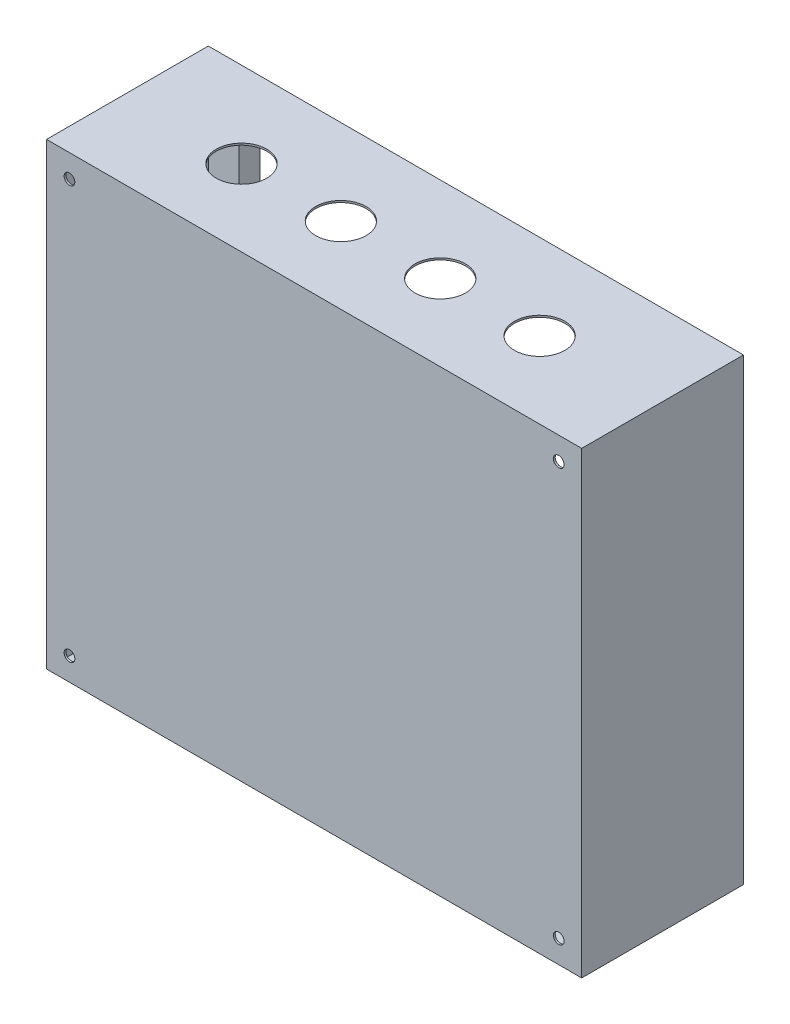
ISO-10303-21;
HEADER;
FILE_DESCRIPTION(('STEP AP214'),'2;1');
FILE_NAME('part.step','',(''),(''),'','','');
FILE_SCHEMA(('AUTOMOTIVE_DESIGN { 1 0 10303 214 1 1 1 1 }'));
ENDSEC;
DATA;
#1=APPLICATION_CONTEXT('core data for automotive mechanical design processes');
#2=APPLICATION_PROTOCOL_DEFINITION('international standard','automotive_design',2000,#1);
#3=PRODUCT_CONTEXT('',#1,'mechanical');
#4=PRODUCT('Part','Part','',(#3));
#5=PRODUCT_RELATED_PRODUCT_CATEGORY('part','',(#4));
#6=PRODUCT_DEFINITION_FORMATION('','',#4);
#7=PRODUCT_DEFINITION_CONTEXT('part definition',#1,'design');
#8=PRODUCT_DEFINITION('design','',#6,#7);
#9=PRODUCT_DEFINITION_SHAPE('','',#8);
#10=(LENGTH_UNIT() NAMED_UNIT(*) SI_UNIT(.MILLI.,.METRE.));
#11=(NAMED_UNIT(*) PLANE_ANGLE_UNIT() SI_UNIT($,.RADIAN.));
#12=(NAMED_UNIT(*) SI_UNIT($,.STERADIAN.) SOLID_ANGLE_UNIT());
#13=UNCERTAINTY_MEASURE_WITH_UNIT(LENGTH_MEASURE(1.E-05),#10,'distance_accuracy_value','');
#14=(GEOMETRIC_REPRESENTATION_CONTEXT(3) GLOBAL_UNCERTAINTY_ASSIGNED_CONTEXT((#13)) GLOBAL_UNIT_ASSIGNED_CONTEXT((#10,
#11,#12)) REPRESENTATION_CONTEXT('',''));
#15=CARTESIAN_POINT('',(0.,0.,0.));
#16=DIRECTION('',(0.,0.,1.));
#17=DIRECTION('',(1.,0.,0.));
#18=AXIS2_PLACEMENT_3D('',#15,#16,#17);
#19=CARTESIAN_POINT('',(0.,0.,-52.9));
#20=DIRECTION('',(0.,0.,1.));
#21=DIRECTION('',(1.,0.,0.));
#22=AXIS2_PLACEMENT_3D('',#19,#20,#21);
#23=PLANE('',#22);
#24=DIRECTION('',(1.,0.,0.));
#25=VECTOR('',#24,1.);
#26=CARTESIAN_POINT('',(-175.,-150.,-52.9));
#27=LINE('',#26,#25);
#28=CARTESIAN_POINT('',(-175.,-150.,-52.9));
#29=VERTEX_POINT('',#28);
#30=CARTESIAN_POINT('',(175.,-150.,-52.9));
#31=VERTEX_POINT('',#30);
#32=EDGE_CURVE('E328',#29,#31,#27,.T.);
#33=ORIENTED_EDGE('',*,*,#32,.F.);
#34=DIRECTION('',(0.,-1.,0.));
#35=VECTOR('',#34,1.);
#36=CARTESIAN_POINT('',(-175.,-150.,-52.9));
#37=LINE('',#36,#35);
#38=CARTESIAN_POINT('',(-175.,150.,-52.9));
#39=VERTEX_POINT('',#38);
#40=EDGE_CURVE('E333',#39,#29,#37,.T.);
#41=ORIENTED_EDGE('',*,*,#40,.F.);
#42=DIRECTION('',(-1.,0.,0.));
#43=VECTOR('',#42,1.);
#44=CARTESIAN_POINT('',(-175.,150.,-52.9));
#45=LINE('',#44,#43);
#46=CARTESIAN_POINT('',(175.,150.,-52.9));
#47=VERTEX_POINT('',#46);
#48=EDGE_CURVE('E344',#47,#39,#45,.T.);
#49=ORIENTED_EDGE('',*,*,#48,.F.);
#50=DIRECTION('',(0.,1.,0.));
#51=VECTOR('',#50,1.);
#52=CARTESIAN_POINT('',(175.,-150.,-52.9));
#53=LINE('',#52,#51);
#54=EDGE_CURVE('E342',#31,#47,#53,.T.);
#55=ORIENTED_EDGE('',*,*,#54,.F.);
#56=EDGE_LOOP('',(#33,#41,#49,#55));
#57=FACE_BOUND('',#56,.T.);
#58=DIRECTION('',(0.,-1.,0.));
#59=VECTOR('',#58,1.);
#60=CARTESIAN_POINT('',(155.,130.,-52.9));
#61=LINE('',#60,#59);
#62=CARTESIAN_POINT('',(155.,130.,-52.9));
#63=VERTEX_POINT('',#62);
#64=CARTESIAN_POINT('',(155.,-130.,-52.9));
#65=VERTEX_POINT('',#64);
#66=EDGE_CURVE('E278',#63,#65,#61,.T.);
#67=ORIENTED_EDGE('',*,*,#66,.F.);
#68=DIRECTION('',(1.,0.,0.));
#69=VECTOR('',#68,1.);
#70=CARTESIAN_POINT('',(-155.,130.,-52.9));
#71=LINE('',#70,#69);
#72=CARTESIAN_POINT('',(-155.,130.,-52.9));
#73=VERTEX_POINT('',#72);
#74=EDGE_CURVE('E300',#73,#63,#71,.T.);
#75=ORIENTED_EDGE('',*,*,#74,.F.);
#76=DIRECTION('',(0.,1.,0.));
#77=VECTOR('',#76,1.);
#78=CARTESIAN_POINT('',(-155.,-130.,-52.9));
#79=LINE('',#78,#77);
#80=CARTESIAN_POINT('',(-155.,-130.,-52.9));
#81=VERTEX_POINT('',#80);
#82=EDGE_CURVE('E313',#81,#73,#79,.T.);
#83=ORIENTED_EDGE('',*,*,#82,.F.);
#84=DIRECTION('',(-1.,0.,0.));
#85=VECTOR('',#84,1.);
#86=CARTESIAN_POINT('',(155.,-130.,-52.9));
#87=LINE('',#86,#85);
#88=EDGE_CURVE('E60',#65,#81,#87,.T.);
#89=ORIENTED_EDGE('',*,*,#88,.F.);
#90=EDGE_LOOP('',(#67,#75,#83,#89));
#91=FACE_BOUND('',#90,.T.);
#92=ADVANCED_FACE('F37',(#57,#91),#23,.F.);
#93=CARTESIAN_POINT('',(-175.,-150.,52.9));
#94=DIRECTION('',(0.,1.,0.));
#95=DIRECTION('',(0.,0.,1.));
#96=AXIS2_PLACEMENT_3D('',#93,#94,#95);
#97=PLANE('',#96);
#98=ORIENTED_EDGE('',*,*,#32,.T.);
#99=DIRECTION('',(0.,0.,-1.));
#100=VECTOR('',#99,1.);
#101=CARTESIAN_POINT('',(175.,-150.,52.9));
#102=LINE('',#101,#100);
#103=CARTESIAN_POINT('',(175.,-150.,52.9));
#104=VERTEX_POINT('',#103);
#105=EDGE_CURVE('E11',#104,#31,#102,.T.);
#106=ORIENTED_EDGE('',*,*,#105,.F.);
#107=DIRECTION('',(1.,0.,0.));
#108=VECTOR('',#107,1.);
#109=CARTESIAN_POINT('',(-175.,-150.,52.9));
#110=LINE('',#109,#108);
#111=CARTESIAN_POINT('',(-175.,-150.,52.9));
#112=VERTEX_POINT('',#111);
#113=EDGE_CURVE('E329',#112,#104,#110,.T.);
#114=ORIENTED_EDGE('',*,*,#113,.F.);
#115=DIRECTION('',(0.,0.,-1.));
#116=VECTOR('',#115,1.);
#117=CARTESIAN_POINT('',(-175.,-150.,52.9));
#118=LINE('',#117,#116);
#119=EDGE_CURVE('E339',#112,#29,#118,.T.);
#120=ORIENTED_EDGE('',*,*,#119,.T.);
#121=EDGE_LOOP('',(#98,#106,#114,#120));
#122=FACE_BOUND('',#121,.T.);
#123=ADVANCED_FACE('F39',(#122),#97,.F.);
#124=CARTESIAN_POINT('',(175.,-150.,52.9));
#125=DIRECTION('',(-1.,0.,0.));
#126=DIRECTION('',(0.,0.,1.));
#127=AXIS2_PLACEMENT_3D('',#124,#125,#126);
#128=PLANE('',#127);
#129=ORIENTED_EDGE('',*,*,#54,.T.);
#130=DIRECTION('',(0.,0.,-1.));
#131=VECTOR('',#130,1.);
#132=CARTESIAN_POINT('',(175.,150.,52.9));
#133=LINE('',#132,#131);
#134=CARTESIAN_POINT('',(175.,150.,52.9));
#135=VERTEX_POINT('',#134);
#136=EDGE_CURVE('E45',#135,#47,#133,.T.);
#137=ORIENTED_EDGE('',*,*,#136,.F.);
#138=DIRECTION('',(0.,1.,0.));
#139=VECTOR('',#138,1.);
#140=CARTESIAN_POINT('',(175.,-150.,52.9));
#141=LINE('',#140,#139);
#142=EDGE_CURVE('E332',#104,#135,#141,.T.);
#143=ORIENTED_EDGE('',*,*,#142,.F.);
#144=ORIENTED_EDGE('',*,*,#105,.T.);
#145=EDGE_LOOP('',(#129,#137,#143,#144));
#146=FACE_BOUND('',#145,.T.);
#147=ADVANCED_FACE('F371',(#146),#128,.F.);
#148=CARTESIAN_POINT('',(-175.,150.,52.9));
#149=DIRECTION('',(0.,-1.,0.));
#150=DIRECTION('',(1.,0.,0.));
#151=AXIS2_PLACEMENT_3D('',#148,#149,#150);
#152=PLANE('',#151);
#153=CARTESIAN_POINT('',(-97.4999999999999,150.,2.90000000000045));
#154=DIRECTION('',(0.,1.,0.));
#155=DIRECTION('',(-1.,0.,0.));
#156=AXIS2_PLACEMENT_3D('',#153,#154,#155);
#157=CIRCLE('',#156,16.5);
#158=CARTESIAN_POINT('',(-114.,150.,2.90000000000045));
#159=VERTEX_POINT('',#158);
#160=EDGE_CURVE('E445',#159,#159,#157,.T.);
#161=ORIENTED_EDGE('',*,*,#160,.F.);
#162=EDGE_LOOP('',(#161));
#163=FACE_BOUND('',#162,.T.);
#164=CARTESIAN_POINT('',(97.5000000000001,150.,2.89999999999999));
#165=DIRECTION('',(0.,1.,0.));
#166=DIRECTION('',(-1.,0.,0.));
#167=AXIS2_PLACEMENT_3D('',#164,#165,#166);
#168=CIRCLE('',#167,16.5);
#169=CARTESIAN_POINT('',(81.0000000000001,150.,2.89999999999999));
#170=VERTEX_POINT('',#169);
#171=EDGE_CURVE('E439',#170,#170,#168,.T.);
#172=ORIENTED_EDGE('',*,*,#171,.F.);
#173=EDGE_LOOP('',(#172));
#174=FACE_BOUND('',#173,.T.);
#175=CARTESIAN_POINT('',(32.5000000000001,150.,2.89999999999999));
#176=DIRECTION('',(0.,1.,0.));
#177=DIRECTION('',(-1.,0.,0.));
#178=AXIS2_PLACEMENT_3D('',#175,#176,#177);
#179=CIRCLE('',#178,16.5);
#180=CARTESIAN_POINT('',(16.0000000000001,150.,2.89999999999999));
#181=VERTEX_POINT('',#180);
#182=EDGE_CURVE('E433',#181,#181,#179,.T.);
#183=ORIENTED_EDGE('',*,*,#182,.F.);
#184=EDGE_LOOP('',(#183));
#185=FACE_BOUND('',#184,.T.);
#186=CARTESIAN_POINT('',(-32.4999999999999,150.,2.89999999999999));
#187=DIRECTION('',(0.,1.,0.));
#188=DIRECTION('',(-1.,0.,0.));
#189=AXIS2_PLACEMENT_3D('',#186,#187,#188);
#190=CIRCLE('',#189,16.5);
#191=CARTESIAN_POINT('',(-48.9999999999999,150.,2.89999999999999));
#192=VERTEX_POINT('',#191);
#193=EDGE_CURVE('E424',#192,#192,#190,.T.);
#194=ORIENTED_EDGE('',*,*,#193,.F.);
#195=EDGE_LOOP('',(#194));
#196=FACE_BOUND('',#195,.T.);
#197=ORIENTED_EDGE('',*,*,#48,.T.);
#198=DIRECTION('',(0.,0.,-1.));
#199=VECTOR('',#198,1.);
#200=CARTESIAN_POINT('',(-175.,150.,52.9));
#201=LINE('',#200,#199);
#202=CARTESIAN_POINT('',(-175.,150.,52.9));
#203=VERTEX_POINT('',#202);
#204=EDGE_CURVE('E349',#203,#39,#201,.T.);
#205=ORIENTED_EDGE('',*,*,#204,.F.);
#206=DIRECTION('',(-1.,0.,0.));
#207=VECTOR('',#206,1.);
#208=CARTESIAN_POINT('',(-175.,150.,52.9));
#209=LINE('',#208,#207);
#210=EDGE_CURVE('E335',#135,#203,#209,.T.);
#211=ORIENTED_EDGE('',*,*,#210,.F.);
#212=ORIENTED_EDGE('',*,*,#136,.T.);
#213=EDGE_LOOP('',(#197,#205,#211,#212));
#214=FACE_BOUND('',#213,.T.);
#215=ADVANCED_FACE('F356',(#163,#174,#185,#196,#214),#152,.F.);
#216=CARTESIAN_POINT('',(-175.,-150.,52.9));
#217=DIRECTION('',(1.,0.,0.));
#218=DIRECTION('',(0.,0.,-1.));
#219=AXIS2_PLACEMENT_3D('',#216,#217,#218);
#220=PLANE('',#219);
#221=ORIENTED_EDGE('',*,*,#40,.T.);
#222=ORIENTED_EDGE('',*,*,#119,.F.);
#223=DIRECTION('',(0.,-1.,0.));
#224=VECTOR('',#223,1.);
#225=CARTESIAN_POINT('',(-175.,-150.,52.9));
#226=LINE('',#225,#224);
#227=EDGE_CURVE('E337',#203,#112,#226,.T.);
#228=ORIENTED_EDGE('',*,*,#227,.F.);
#229=ORIENTED_EDGE('',*,*,#204,.T.);
#230=EDGE_LOOP('',(#221,#222,#228,#229));
#231=FACE_BOUND('',#230,.T.);
#232=ADVANCED_FACE('F364',(#231),#220,.F.);
#233=CARTESIAN_POINT('',(0.,0.,52.9));
#234=DIRECTION('',(0.,0.,1.));
#235=DIRECTION('',(1.,0.,0.));
#236=AXIS2_PLACEMENT_3D('',#233,#234,#235);
#237=PLANE('',#236);
#238=CARTESIAN_POINT('',(160.,135.,52.9));
#239=DIRECTION('',(0.,0.,1.));
#240=DIRECTION('',(-1.,0.,0.));
#241=AXIS2_PLACEMENT_3D('',#238,#239,#240);
#242=CIRCLE('',#241,3.49999999999994);
#243=CARTESIAN_POINT('',(156.5,135.,52.9));
#244=VERTEX_POINT('',#243);
#245=EDGE_CURVE('E400',#244,#244,#242,.T.);
#246=ORIENTED_EDGE('',*,*,#245,.F.);
#247=EDGE_LOOP('',(#246));
#248=FACE_BOUND('',#247,.T.);
#249=CARTESIAN_POINT('',(160.,-135.,52.9));
#250=DIRECTION('',(0.,0.,1.));
#251=DIRECTION('',(1.,0.,0.));
#252=AXIS2_PLACEMENT_3D('',#249,#250,#251);
#253=CIRCLE('',#252,3.49999999999994);
#254=CARTESIAN_POINT('',(163.5,-135.,52.9));
#255=VERTEX_POINT('',#254);
#256=EDGE_CURVE('E404',#255,#255,#253,.T.);
#257=ORIENTED_EDGE('',*,*,#256,.F.);
#258=EDGE_LOOP('',(#257));
#259=FACE_BOUND('',#258,.T.);
#260=CARTESIAN_POINT('',(-160.,-135.,52.9));
#261=DIRECTION('',(0.,0.,1.));
#262=DIRECTION('',(-1.,0.,0.));
#263=AXIS2_PLACEMENT_3D('',#260,#261,#262);
#264=CIRCLE('',#263,3.49999999999998);
#265=CARTESIAN_POINT('',(-163.5,-135.,52.9));
#266=VERTEX_POINT('',#265);
#267=EDGE_CURVE('E408',#266,#266,#264,.T.);
#268=ORIENTED_EDGE('',*,*,#267,.F.);
#269=EDGE_LOOP('',(#268));
#270=FACE_BOUND('',#269,.T.);
#271=CARTESIAN_POINT('',(-160.,135.,52.9));
#272=DIRECTION('',(0.,0.,1.));
#273=DIRECTION('',(1.,0.,0.));
#274=AXIS2_PLACEMENT_3D('',#271,#272,#273);
#275=CIRCLE('',#274,3.49999999999999);
#276=CARTESIAN_POINT('',(-156.5,135.,52.9));
#277=VERTEX_POINT('',#276);
#278=EDGE_CURVE('E209',#277,#277,#275,.T.);
#279=ORIENTED_EDGE('',*,*,#278,.F.);
#280=EDGE_LOOP('',(#279));
#281=FACE_BOUND('',#280,.T.);
#282=ORIENTED_EDGE('',*,*,#113,.T.);
#283=ORIENTED_EDGE('',*,*,#142,.T.);
#284=ORIENTED_EDGE('',*,*,#210,.T.);
#285=ORIENTED_EDGE('',*,*,#227,.T.);
#286=EDGE_LOOP('',(#282,#283,#284,#285));
#287=FACE_BOUND('',#286,.T.);
#288=ADVANCED_FACE('F370',(#248,#259,#270,#281,#287),#237,.T.);
#289=CARTESIAN_POINT('',(155.,130.,-64.9));
#290=DIRECTION('',(-1.,0.,0.));
#291=DIRECTION('',(0.,0.,1.));
#292=AXIS2_PLACEMENT_3D('',#289,#290,#291);
#293=PLANE('',#292);
#294=ORIENTED_EDGE('',*,*,#66,.T.);
#295=DIRECTION('',(0.,0.,1.));
#296=VECTOR('',#295,1.);
#297=CARTESIAN_POINT('',(155.,-130.,-64.9));
#298=LINE('',#297,#296);
#299=CARTESIAN_POINT('',(155.,-130.,-64.9));
#300=VERTEX_POINT('',#299);
#301=EDGE_CURVE('E326',#300,#65,#298,.T.);
#302=ORIENTED_EDGE('',*,*,#301,.F.);
#303=DIRECTION('',(0.,-1.,0.));
#304=VECTOR('',#303,1.);
#305=CARTESIAN_POINT('',(155.,130.,-64.9));
#306=LINE('',#305,#304);
#307=CARTESIAN_POINT('',(155.,130.,-64.9));
#308=VERTEX_POINT('',#307);
#309=EDGE_CURVE('E296',#308,#300,#306,.T.);
#310=ORIENTED_EDGE('',*,*,#309,.F.);
#311=DIRECTION('',(0.,0.,1.));
#312=VECTOR('',#311,1.);
#313=CARTESIAN_POINT('',(155.,130.,-64.9));
#314=LINE('',#313,#312);
#315=EDGE_CURVE('E309',#308,#63,#314,.T.);
#316=ORIENTED_EDGE('',*,*,#315,.T.);
#317=EDGE_LOOP('',(#294,#302,#310,#316));
#318=FACE_BOUND('',#317,.T.);
#319=ADVANCED_FACE('F390',(#318),#293,.F.);
#320=CARTESIAN_POINT('',(155.,-130.,-64.9));
#321=DIRECTION('',(0.,1.,0.));
#322=DIRECTION('',(0.,0.,1.));
#323=AXIS2_PLACEMENT_3D('',#320,#321,#322);
#324=PLANE('',#323);
#325=ORIENTED_EDGE('',*,*,#88,.T.);
#326=DIRECTION('',(0.,0.,1.));
#327=VECTOR('',#326,1.);
#328=CARTESIAN_POINT('',(-155.,-130.,-64.9));
#329=LINE('',#328,#327);
#330=CARTESIAN_POINT('',(-155.,-130.,-64.9));
#331=VERTEX_POINT('',#330);
#332=EDGE_CURVE('E323',#331,#81,#329,.T.);
#333=ORIENTED_EDGE('',*,*,#332,.F.);
#334=DIRECTION('',(-1.,0.,0.));
#335=VECTOR('',#334,1.);
#336=CARTESIAN_POINT('',(155.,-130.,-64.9));
#337=LINE('',#336,#335);
#338=EDGE_CURVE('E299',#300,#331,#337,.T.);
#339=ORIENTED_EDGE('',*,*,#338,.F.);
#340=ORIENTED_EDGE('',*,*,#301,.T.);
#341=EDGE_LOOP('',(#325,#333,#339,#340));
#342=FACE_BOUND('',#341,.T.);
#343=ADVANCED_FACE('F395',(#342),#324,.F.);
#344=CARTESIAN_POINT('',(-155.,-130.,-64.9));
#345=DIRECTION('',(1.,0.,0.));
#346=DIRECTION('',(0.,0.,-1.));
#347=AXIS2_PLACEMENT_3D('',#344,#345,#346);
#348=PLANE('',#347);
#349=ORIENTED_EDGE('',*,*,#82,.T.);
#350=DIRECTION('',(0.,0.,1.));
#351=VECTOR('',#350,1.);
#352=CARTESIAN_POINT('',(-155.,130.,-64.9));
#353=LINE('',#352,#351);
#354=CARTESIAN_POINT('',(-155.,130.,-64.9));
#355=VERTEX_POINT('',#354);
#356=EDGE_CURVE('E320',#355,#73,#353,.T.);
#357=ORIENTED_EDGE('',*,*,#356,.F.);
#358=DIRECTION('',(0.,1.,0.));
#359=VECTOR('',#358,1.);
#360=CARTESIAN_POINT('',(-155.,-130.,-64.9));
#361=LINE('',#360,#359);
#362=EDGE_CURVE('E303',#331,#355,#361,.T.);
#363=ORIENTED_EDGE('',*,*,#362,.F.);
#364=ORIENTED_EDGE('',*,*,#332,.T.);
#365=EDGE_LOOP('',(#349,#357,#363,#364));
#366=FACE_BOUND('',#365,.T.);
#367=ADVANCED_FACE('F561',(#366),#348,.F.);
#368=CARTESIAN_POINT('',(-155.,130.,-64.9));
#369=DIRECTION('',(0.,-1.,0.));
#370=DIRECTION('',(1.,0.,0.));
#371=AXIS2_PLACEMENT_3D('',#368,#369,#370);
#372=PLANE('',#371);
#373=ORIENTED_EDGE('',*,*,#74,.T.);
#374=ORIENTED_EDGE('',*,*,#315,.F.);
#375=DIRECTION('',(1.,0.,0.));
#376=VECTOR('',#375,1.);
#377=CARTESIAN_POINT('',(-155.,130.,-64.9));
#378=LINE('',#377,#376);
#379=EDGE_CURVE('E306',#355,#308,#378,.T.);
#380=ORIENTED_EDGE('',*,*,#379,.F.);
#381=ORIENTED_EDGE('',*,*,#356,.T.);
#382=EDGE_LOOP('',(#373,#374,#380,#381));
#383=FACE_BOUND('',#382,.T.);
#384=ADVANCED_FACE('F547',(#383),#372,.F.);
#385=CARTESIAN_POINT('',(155.,-130.,-64.9));
#386=DIRECTION('',(0.,-0.707106781186546,0.707106781186549));
#387=DIRECTION('',(0.,-0.707106781186549,-0.707106781186546));
#388=AXIS2_PLACEMENT_3D('',#385,#386,#387);
#389=PLANE('',#388);
#390=ORIENTED_EDGE('',*,*,#338,.T.);
#391=DIRECTION('',(0.577350269189627,0.577350269189627,0.577350269189624));
#392=VECTOR('',#391,1.);
#393=CARTESIAN_POINT('',(-155.,-130.,-64.9));
#394=LINE('',#393,#392);
#395=CARTESIAN_POINT('',(-159.,-134.,-68.9));
#396=VERTEX_POINT('',#395);
#397=EDGE_CURVE('E275',#396,#331,#394,.T.);
#398=ORIENTED_EDGE('',*,*,#397,.F.);
#399=DIRECTION('',(1.,0.,0.));
#400=VECTOR('',#399,1.);
#401=CARTESIAN_POINT('',(155.,-134.,-68.9));
#402=LINE('',#401,#400);
#403=CARTESIAN_POINT('',(159.,-134.,-68.9));
#404=VERTEX_POINT('',#403);
#405=EDGE_CURVE('E228',#404,#396,#402,.F.);
#406=ORIENTED_EDGE('',*,*,#405,.F.);
#407=DIRECTION('',(-0.577350269189627,0.577350269189627,0.577350269189624));
#408=VECTOR('',#407,1.);
#409=CARTESIAN_POINT('',(155.,-130.,-64.9));
#410=LINE('',#409,#408);
#411=EDGE_CURVE('E280',#404,#300,#410,.T.);
#412=ORIENTED_EDGE('',*,*,#411,.T.);
#413=EDGE_LOOP('',(#390,#398,#406,#412));
#414=FACE_BOUND('',#413,.T.);
#415=ADVANCED_FACE('F543',(#414),#389,.T.);
#416=CARTESIAN_POINT('',(-155.,-130.,-64.9));
#417=DIRECTION('',(-0.707106781186546,0.,0.707106781186549));
#418=DIRECTION('',(0.707106781186549,0.,0.707106781186546));
#419=AXIS2_PLACEMENT_3D('',#416,#417,#418);
#420=PLANE('',#419);
#421=ORIENTED_EDGE('',*,*,#362,.T.);
#422=DIRECTION('',(0.577350269189627,-0.577350269189626,0.577350269189624));
#423=VECTOR('',#422,1.);
#424=CARTESIAN_POINT('',(-155.,130.,-64.9));
#425=LINE('',#424,#423);
#426=CARTESIAN_POINT('',(-159.,134.,-68.9));
#427=VERTEX_POINT('',#426);
#428=EDGE_CURVE('E279',#427,#355,#425,.T.);
#429=ORIENTED_EDGE('',*,*,#428,.F.);
#430=DIRECTION('',(0.,-1.,0.));
#431=VECTOR('',#430,1.);
#432=CARTESIAN_POINT('',(-159.,-130.,-68.9));
#433=LINE('',#432,#431);
#434=EDGE_CURVE('E291',#396,#427,#433,.F.);
#435=ORIENTED_EDGE('',*,*,#434,.F.);
#436=ORIENTED_EDGE('',*,*,#397,.T.);
#437=EDGE_LOOP('',(#421,#429,#435,#436));
#438=FACE_BOUND('',#437,.T.);
#439=ADVANCED_FACE('F546',(#438),#420,.T.);
#440=CARTESIAN_POINT('',(-155.,130.,-64.9));
#441=DIRECTION('',(0.,0.707106781186546,0.707106781186549));
#442=DIRECTION('',(0.,-0.707106781186549,0.707106781186546));
#443=AXIS2_PLACEMENT_3D('',#440,#441,#442);
#444=PLANE('',#443);
#445=ORIENTED_EDGE('',*,*,#379,.T.);
#446=DIRECTION('',(-0.577350269189627,-0.577350269189627,0.577350269189624));
#447=VECTOR('',#446,1.);
#448=CARTESIAN_POINT('',(155.,130.,-64.9));
#449=LINE('',#448,#447);
#450=CARTESIAN_POINT('',(159.,134.,-68.9));
#451=VERTEX_POINT('',#450);
#452=EDGE_CURVE('E283',#451,#308,#449,.T.);
#453=ORIENTED_EDGE('',*,*,#452,.F.);
#454=DIRECTION('',(-1.,0.,0.));
#455=VECTOR('',#454,1.);
#456=CARTESIAN_POINT('',(-155.,134.,-68.9));
#457=LINE('',#456,#455);
#458=EDGE_CURVE('E293',#427,#451,#457,.F.);
#459=ORIENTED_EDGE('',*,*,#458,.F.);
#460=ORIENTED_EDGE('',*,*,#428,.T.);
#461=EDGE_LOOP('',(#445,#453,#459,#460));
#462=FACE_BOUND('',#461,.T.);
#463=ADVANCED_FACE('F551',(#462),#444,.T.);
#464=CARTESIAN_POINT('',(155.,130.,-64.9));
#465=DIRECTION('',(0.707106781186546,0.,0.707106781186549));
#466=DIRECTION('',(0.707106781186549,0.,-0.707106781186546));
#467=AXIS2_PLACEMENT_3D('',#464,#465,#466);
#468=PLANE('',#467);
#469=ORIENTED_EDGE('',*,*,#309,.T.);
#470=ORIENTED_EDGE('',*,*,#411,.F.);
#471=DIRECTION('',(0.,1.,0.));
#472=VECTOR('',#471,1.);
#473=CARTESIAN_POINT('',(159.,130.,-68.9));
#474=LINE('',#473,#472);
#475=EDGE_CURVE('E284',#451,#404,#474,.F.);
#476=ORIENTED_EDGE('',*,*,#475,.F.);
#477=ORIENTED_EDGE('',*,*,#452,.T.);
#478=EDGE_LOOP('',(#469,#470,#476,#477));
#479=FACE_BOUND('',#478,.T.);
#480=ADVANCED_FACE('F541',(#479),#468,.T.);
#481=CARTESIAN_POINT('',(0.,0.,-68.9));
#482=DIRECTION('',(0.,0.,-1.));
#483=DIRECTION('',(-1.,0.,0.));
#484=AXIS2_PLACEMENT_3D('',#481,#482,#483);
#485=PLANE('',#484);
#486=DIRECTION('',(1.,0.,0.));
#487=VECTOR('',#486,1.);
#488=CARTESIAN_POINT('',(155.,-132.302943725152,-68.9));
#489=LINE('',#488,#487);
#490=CARTESIAN_POINT('',(157.302943725152,-132.302943725152,-68.9));
#491=VERTEX_POINT('',#490);
#492=CARTESIAN_POINT('',(-157.302943725152,-132.302943725152,-68.9));
#493=VERTEX_POINT('',#492);
#494=EDGE_CURVE('E271',#491,#493,#489,.F.);
#495=ORIENTED_EDGE('',*,*,#494,.F.);
#496=DIRECTION('',(0.,1.,0.));
#497=VECTOR('',#496,1.);
#498=CARTESIAN_POINT('',(157.302943725152,130.,-68.9));
#499=LINE('',#498,#497);
#500=CARTESIAN_POINT('',(157.302943725152,132.302943725152,-68.9));
#501=VERTEX_POINT('',#500);
#502=EDGE_CURVE('E266',#501,#491,#499,.F.);
#503=ORIENTED_EDGE('',*,*,#502,.F.);
#504=DIRECTION('',(-1.,0.,0.));
#505=VECTOR('',#504,1.);
#506=CARTESIAN_POINT('',(-155.,132.302943725152,-68.9));
#507=LINE('',#506,#505);
#508=CARTESIAN_POINT('',(-157.302943725152,132.302943725152,-68.9));
#509=VERTEX_POINT('',#508);
#510=EDGE_CURVE('E270',#509,#501,#507,.F.);
#511=ORIENTED_EDGE('',*,*,#510,.F.);
#512=DIRECTION('',(0.,-1.,0.));
#513=VECTOR('',#512,1.);
#514=CARTESIAN_POINT('',(-157.302943725152,-130.,-68.9));
#515=LINE('',#514,#513);
#516=EDGE_CURVE('E268',#493,#509,#515,.F.);
#517=ORIENTED_EDGE('',*,*,#516,.F.);
#518=EDGE_LOOP('',(#495,#503,#511,#517));
#519=FACE_BOUND('',#518,.T.);
#520=ORIENTED_EDGE('',*,*,#405,.T.);
#521=ORIENTED_EDGE('',*,*,#434,.T.);
#522=ORIENTED_EDGE('',*,*,#458,.T.);
#523=ORIENTED_EDGE('',*,*,#475,.T.);
#524=EDGE_LOOP('',(#520,#521,#522,#523));
#525=FACE_BOUND('',#524,.T.);
#526=ADVANCED_FACE('F492',(#519,#525),#485,.T.);
#527=CARTESIAN_POINT('',(0.,0.,-51.7));
#528=DIRECTION('',(0.,0.,1.));
#529=DIRECTION('',(1.,0.,0.));
#530=AXIS2_PLACEMENT_3D('',#527,#528,#529);
#531=PLANE('',#530);
#532=DIRECTION('',(1.,0.,0.));
#533=VECTOR('',#532,1.);
#534=CARTESIAN_POINT('',(-175.,-148.8,-51.7));
#535=LINE('',#534,#533);
#536=CARTESIAN_POINT('',(-173.8,-148.8,-51.7));
#537=VERTEX_POINT('',#536);
#538=CARTESIAN_POINT('',(173.8,-148.8,-51.7));
#539=VERTEX_POINT('',#538);
#540=EDGE_CURVE('E179',#537,#539,#535,.T.);
#541=ORIENTED_EDGE('',*,*,#540,.T.);
#542=DIRECTION('',(0.,1.,0.));
#543=VECTOR('',#542,1.);
#544=CARTESIAN_POINT('',(173.8,-150.,-51.7));
#545=LINE('',#544,#543);
#546=CARTESIAN_POINT('',(173.8,148.8,-51.7));
#547=VERTEX_POINT('',#546);
#548=EDGE_CURVE('E201',#539,#547,#545,.T.);
#549=ORIENTED_EDGE('',*,*,#548,.T.);
#550=DIRECTION('',(-1.,0.,0.));
#551=VECTOR('',#550,1.);
#552=CARTESIAN_POINT('',(-175.,148.8,-51.7));
#553=LINE('',#552,#551);
#554=CARTESIAN_POINT('',(-173.8,148.8,-51.7));
#555=VERTEX_POINT('',#554);
#556=EDGE_CURVE('E181',#547,#555,#553,.T.);
#557=ORIENTED_EDGE('',*,*,#556,.T.);
#558=DIRECTION('',(0.,-1.,0.));
#559=VECTOR('',#558,1.);
#560=CARTESIAN_POINT('',(-173.8,-150.,-51.7));
#561=LINE('',#560,#559);
#562=EDGE_CURVE('E174',#555,#537,#561,.T.);
#563=ORIENTED_EDGE('',*,*,#562,.T.);
#564=EDGE_LOOP('',(#541,#549,#557,#563));
#565=FACE_BOUND('',#564,.T.);
#566=DIRECTION('',(0.,-1.,0.));
#567=VECTOR('',#566,1.);
#568=CARTESIAN_POINT('',(153.8,0.,-51.7));
#569=LINE('',#568,#567);
#570=CARTESIAN_POINT('',(153.8,128.8,-51.7));
#571=VERTEX_POINT('',#570);
#572=CARTESIAN_POINT('',(153.8,-128.8,-51.7));
#573=VERTEX_POINT('',#572);
#574=EDGE_CURVE('E213',#571,#573,#569,.T.);
#575=ORIENTED_EDGE('',*,*,#574,.T.);
#576=DIRECTION('',(-1.,0.,0.));
#577=VECTOR('',#576,1.);
#578=CARTESIAN_POINT('',(0.,-128.8,-51.7));
#579=LINE('',#578,#577);
#580=CARTESIAN_POINT('',(-153.8,-128.8,-51.7));
#581=VERTEX_POINT('',#580);
#582=EDGE_CURVE('E216',#573,#581,#579,.T.);
#583=ORIENTED_EDGE('',*,*,#582,.T.);
#584=DIRECTION('',(0.,1.,0.));
#585=VECTOR('',#584,1.);
#586=CARTESIAN_POINT('',(-153.8,0.,-51.7));
#587=LINE('',#586,#585);
#588=CARTESIAN_POINT('',(-153.8,128.8,-51.7));
#589=VERTEX_POINT('',#588);
#590=EDGE_CURVE('E222',#581,#589,#587,.T.);
#591=ORIENTED_EDGE('',*,*,#590,.T.);
#592=DIRECTION('',(1.,0.,0.));
#593=VECTOR('',#592,1.);
#594=CARTESIAN_POINT('',(0.,128.8,-51.7));
#595=LINE('',#594,#593);
#596=EDGE_CURVE('E218',#589,#571,#595,.T.);
#597=ORIENTED_EDGE('',*,*,#596,.T.);
#598=EDGE_LOOP('',(#575,#583,#591,#597));
#599=FACE_BOUND('',#598,.T.);
#600=ADVANCED_FACE('F176',(#565,#599),#531,.T.);
#601=CARTESIAN_POINT('',(-175.,-148.8,52.9));
#602=DIRECTION('',(0.,1.,0.));
#603=DIRECTION('',(0.,0.,1.));
#604=AXIS2_PLACEMENT_3D('',#601,#602,#603);
#605=PLANE('',#604);
#606=ORIENTED_EDGE('',*,*,#540,.F.);
#607=DIRECTION('',(0.,0.,-1.));
#608=VECTOR('',#607,1.);
#609=CARTESIAN_POINT('',(-173.8,-148.8,52.9));
#610=LINE('',#609,#608);
#611=CARTESIAN_POINT('',(-173.8,-148.8,51.7));
#612=VERTEX_POINT('',#611);
#613=EDGE_CURVE('E188',#612,#537,#610,.T.);
#614=ORIENTED_EDGE('',*,*,#613,.F.);
#615=DIRECTION('',(1.,0.,0.));
#616=VECTOR('',#615,1.);
#617=CARTESIAN_POINT('',(-175.,-148.8,51.7));
#618=LINE('',#617,#616);
#619=CARTESIAN_POINT('',(173.8,-148.8,51.7));
#620=VERTEX_POINT('',#619);
#621=EDGE_CURVE('E185',#612,#620,#618,.T.);
#622=ORIENTED_EDGE('',*,*,#621,.T.);
#623=DIRECTION('',(0.,0.,-1.));
#624=VECTOR('',#623,1.);
#625=CARTESIAN_POINT('',(173.8,-148.8,52.9));
#626=LINE('',#625,#624);
#627=EDGE_CURVE('E200',#620,#539,#626,.T.);
#628=ORIENTED_EDGE('',*,*,#627,.T.);
#629=EDGE_LOOP('',(#606,#614,#622,#628));
#630=FACE_BOUND('',#629,.T.);
#631=ADVANCED_FACE('F198',(#630),#605,.T.);
#632=CARTESIAN_POINT('',(173.8,-150.,52.9));
#633=DIRECTION('',(-1.,0.,0.));
#634=DIRECTION('',(0.,0.,1.));
#635=AXIS2_PLACEMENT_3D('',#632,#633,#634);
#636=PLANE('',#635);
#637=ORIENTED_EDGE('',*,*,#548,.F.);
#638=ORIENTED_EDGE('',*,*,#627,.F.);
#639=DIRECTION('',(0.,1.,0.));
#640=VECTOR('',#639,1.);
#641=CARTESIAN_POINT('',(173.8,-150.,51.7));
#642=LINE('',#641,#640);
#643=CARTESIAN_POINT('',(173.8,148.8,51.7));
#644=VERTEX_POINT('',#643);
#645=EDGE_CURVE('E230',#620,#644,#642,.T.);
#646=ORIENTED_EDGE('',*,*,#645,.T.);
#647=DIRECTION('',(0.,0.,-1.));
#648=VECTOR('',#647,1.);
#649=CARTESIAN_POINT('',(173.8,148.8,52.9));
#650=LINE('',#649,#648);
#651=EDGE_CURVE('E229',#644,#547,#650,.T.);
#652=ORIENTED_EDGE('',*,*,#651,.T.);
#653=EDGE_LOOP('',(#637,#638,#646,#652));
#654=FACE_BOUND('',#653,.T.);
#655=ADVANCED_FACE('F495',(#654),#636,.T.);
#656=CARTESIAN_POINT('',(-175.,148.8,52.9));
#657=DIRECTION('',(0.,-1.,0.));
#658=DIRECTION('',(1.,0.,0.));
#659=AXIS2_PLACEMENT_3D('',#656,#657,#658);
#660=PLANE('',#659);
#661=CARTESIAN_POINT('',(-97.4999999999999,148.8,2.90000000000045));
#662=DIRECTION('',(0.,-1.,0.));
#663=DIRECTION('',(1.,0.,0.));
#664=AXIS2_PLACEMENT_3D('',#661,#662,#663);
#665=CIRCLE('',#664,16.5);
#666=CARTESIAN_POINT('',(-81.,148.8,2.90000000000045));
#667=VERTEX_POINT('',#666);
#668=EDGE_CURVE('E442',#667,#667,#665,.F.);
#669=ORIENTED_EDGE('',*,*,#668,.T.);
#670=EDGE_LOOP('',(#669));
#671=FACE_BOUND('',#670,.T.);
#672=CARTESIAN_POINT('',(97.5000000000001,148.8,2.89999999999999));
#673=DIRECTION('',(0.,-1.,0.));
#674=DIRECTION('',(1.,0.,0.));
#675=AXIS2_PLACEMENT_3D('',#672,#673,#674);
#676=CIRCLE('',#675,16.5);
#677=CARTESIAN_POINT('',(114.,148.8,2.89999999999999));
#678=VERTEX_POINT('',#677);
#679=EDGE_CURVE('E448',#678,#678,#676,.F.);
#680=ORIENTED_EDGE('',*,*,#679,.T.);
#681=EDGE_LOOP('',(#680));
#682=FACE_BOUND('',#681,.T.);
#683=CARTESIAN_POINT('',(32.5000000000001,148.8,2.89999999999999));
#684=DIRECTION('',(0.,-1.,0.));
#685=DIRECTION('',(1.,0.,0.));
#686=AXIS2_PLACEMENT_3D('',#683,#684,#685);
#687=CIRCLE('',#686,16.5);
#688=CARTESIAN_POINT('',(49.0000000000001,148.8,2.89999999999999));
#689=VERTEX_POINT('',#688);
#690=EDGE_CURVE('E436',#689,#689,#687,.F.);
#691=ORIENTED_EDGE('',*,*,#690,.T.);
#692=EDGE_LOOP('',(#691));
#693=FACE_BOUND('',#692,.T.);
#694=CARTESIAN_POINT('',(-32.4999999999999,148.8,2.89999999999999));
#695=DIRECTION('',(0.,-1.,0.));
#696=DIRECTION('',(1.,0.,0.));
#697=AXIS2_PLACEMENT_3D('',#694,#695,#696);
#698=CIRCLE('',#697,16.5);
#699=CARTESIAN_POINT('',(-15.9999999999999,148.8,2.89999999999999));
#700=VERTEX_POINT('',#699);
#701=EDGE_CURVE('E430',#700,#700,#698,.F.);
#702=ORIENTED_EDGE('',*,*,#701,.T.);
#703=EDGE_LOOP('',(#702));
#704=FACE_BOUND('',#703,.T.);
#705=ORIENTED_EDGE('',*,*,#556,.F.);
#706=ORIENTED_EDGE('',*,*,#651,.F.);
#707=DIRECTION('',(-1.,0.,0.));
#708=VECTOR('',#707,1.);
#709=CARTESIAN_POINT('',(-175.,148.8,51.7));
#710=LINE('',#709,#708);
#711=CARTESIAN_POINT('',(-173.8,148.8,51.7));
#712=VERTEX_POINT('',#711);
#713=EDGE_CURVE('E235',#644,#712,#710,.T.);
#714=ORIENTED_EDGE('',*,*,#713,.T.);
#715=DIRECTION('',(0.,0.,-1.));
#716=VECTOR('',#715,1.);
#717=CARTESIAN_POINT('',(-173.8,148.8,52.9));
#718=LINE('',#717,#716);
#719=EDGE_CURVE('E195',#712,#555,#718,.T.);
#720=ORIENTED_EDGE('',*,*,#719,.T.);
#721=EDGE_LOOP('',(#705,#706,#714,#720));
#722=FACE_BOUND('',#721,.T.);
#723=ADVANCED_FACE('F498',(#671,#682,#693,#704,#722),#660,.T.);
#724=CARTESIAN_POINT('',(-173.8,-150.,52.9));
#725=DIRECTION('',(1.,0.,0.));
#726=DIRECTION('',(0.,0.,-1.));
#727=AXIS2_PLACEMENT_3D('',#724,#725,#726);
#728=PLANE('',#727);
#729=ORIENTED_EDGE('',*,*,#562,.F.);
#730=ORIENTED_EDGE('',*,*,#719,.F.);
#731=DIRECTION('',(0.,-1.,0.));
#732=VECTOR('',#731,1.);
#733=CARTESIAN_POINT('',(-173.8,-150.,51.7));
#734=LINE('',#733,#732);
#735=EDGE_CURVE('E191',#712,#612,#734,.T.);
#736=ORIENTED_EDGE('',*,*,#735,.T.);
#737=ORIENTED_EDGE('',*,*,#613,.T.);
#738=EDGE_LOOP('',(#729,#730,#736,#737));
#739=FACE_BOUND('',#738,.T.);
#740=ADVANCED_FACE('F189',(#739),#728,.T.);
#741=CARTESIAN_POINT('',(0.,0.,51.7));
#742=DIRECTION('',(0.,0.,1.));
#743=DIRECTION('',(1.,0.,0.));
#744=AXIS2_PLACEMENT_3D('',#741,#742,#743);
#745=PLANE('',#744);
#746=CARTESIAN_POINT('',(160.,135.,51.7));
#747=DIRECTION('',(0.,0.,1.));
#748=DIRECTION('',(1.,0.,0.));
#749=AXIS2_PLACEMENT_3D('',#746,#747,#748);
#750=CIRCLE('',#749,3.49999999999994);
#751=CARTESIAN_POINT('',(163.5,135.,51.7));
#752=VERTEX_POINT('',#751);
#753=EDGE_CURVE('E416',#752,#752,#750,.F.);
#754=ORIENTED_EDGE('',*,*,#753,.F.);
#755=EDGE_LOOP('',(#754));
#756=FACE_BOUND('',#755,.T.);
#757=CARTESIAN_POINT('',(160.,-135.,51.7));
#758=DIRECTION('',(0.,0.,1.));
#759=DIRECTION('',(1.,0.,0.));
#760=AXIS2_PLACEMENT_3D('',#757,#758,#759);
#761=CIRCLE('',#760,3.49999999999994);
#762=CARTESIAN_POINT('',(163.5,-135.,51.7));
#763=VERTEX_POINT('',#762);
#764=EDGE_CURVE('E420',#763,#763,#761,.F.);
#765=ORIENTED_EDGE('',*,*,#764,.F.);
#766=EDGE_LOOP('',(#765));
#767=FACE_BOUND('',#766,.T.);
#768=CARTESIAN_POINT('',(-160.,-135.,51.7));
#769=DIRECTION('',(0.,0.,1.));
#770=DIRECTION('',(1.,0.,0.));
#771=AXIS2_PLACEMENT_3D('',#768,#769,#770);
#772=CIRCLE('',#771,3.49999999999998);
#773=CARTESIAN_POINT('',(-156.5,-135.,51.7));
#774=VERTEX_POINT('',#773);
#775=EDGE_CURVE('E421',#774,#774,#772,.F.);
#776=ORIENTED_EDGE('',*,*,#775,.F.);
#777=EDGE_LOOP('',(#776));
#778=FACE_BOUND('',#777,.T.);
#779=CARTESIAN_POINT('',(-160.,135.,51.7));
#780=DIRECTION('',(0.,0.,1.));
#781=DIRECTION('',(1.,0.,0.));
#782=AXIS2_PLACEMENT_3D('',#779,#780,#781);
#783=CIRCLE('',#782,3.49999999999999);
#784=CARTESIAN_POINT('',(-156.5,135.,51.7));
#785=VERTEX_POINT('',#784);
#786=EDGE_CURVE('E412',#785,#785,#783,.F.);
#787=ORIENTED_EDGE('',*,*,#786,.F.);
#788=EDGE_LOOP('',(#787));
#789=FACE_BOUND('',#788,.T.);
#790=ORIENTED_EDGE('',*,*,#621,.F.);
#791=ORIENTED_EDGE('',*,*,#735,.F.);
#792=ORIENTED_EDGE('',*,*,#713,.F.);
#793=ORIENTED_EDGE('',*,*,#645,.F.);
#794=EDGE_LOOP('',(#790,#791,#792,#793));
#795=FACE_BOUND('',#794,.T.);
#796=ADVANCED_FACE('F505',(#756,#767,#778,#789,#795),#745,.F.);
#797=CARTESIAN_POINT('',(153.8,130.,-64.9));
#798=DIRECTION('',(-1.,0.,0.));
#799=DIRECTION('',(0.,0.,1.));
#800=AXIS2_PLACEMENT_3D('',#797,#798,#799);
#801=PLANE('',#800);
#802=ORIENTED_EDGE('',*,*,#574,.F.);
#803=DIRECTION('',(0.,0.,1.));
#804=VECTOR('',#803,1.);
#805=CARTESIAN_POINT('',(153.8,128.8,-64.9));
#806=LINE('',#805,#804);
#807=CARTESIAN_POINT('',(153.8,128.8,-65.3970562748477));
#808=VERTEX_POINT('',#807);
#809=EDGE_CURVE('E242',#808,#571,#806,.T.);
#810=ORIENTED_EDGE('',*,*,#809,.F.);
#811=DIRECTION('',(0.,1.,0.));
#812=VECTOR('',#811,1.);
#813=CARTESIAN_POINT('',(153.8,130.,-65.3970562748477));
#814=LINE('',#813,#812);
#815=CARTESIAN_POINT('',(153.8,-128.8,-65.3970562748477));
#816=VERTEX_POINT('',#815);
#817=EDGE_CURVE('E221',#808,#816,#814,.F.);
#818=ORIENTED_EDGE('',*,*,#817,.T.);
#819=DIRECTION('',(0.,0.,1.));
#820=VECTOR('',#819,1.);
#821=CARTESIAN_POINT('',(153.8,-128.8,-64.9));
#822=LINE('',#821,#820);
#823=EDGE_CURVE('E202',#816,#573,#822,.T.);
#824=ORIENTED_EDGE('',*,*,#823,.T.);
#825=EDGE_LOOP('',(#802,#810,#818,#824));
#826=FACE_BOUND('',#825,.T.);
#827=ADVANCED_FACE('F508',(#826),#801,.T.);
#828=CARTESIAN_POINT('',(155.,-128.8,-64.9));
#829=DIRECTION('',(0.,1.,0.));
#830=DIRECTION('',(0.,0.,1.));
#831=AXIS2_PLACEMENT_3D('',#828,#829,#830);
#832=PLANE('',#831);
#833=ORIENTED_EDGE('',*,*,#582,.F.);
#834=ORIENTED_EDGE('',*,*,#823,.F.);
#835=DIRECTION('',(1.,0.,0.));
#836=VECTOR('',#835,1.);
#837=CARTESIAN_POINT('',(155.,-128.8,-65.3970562748477));
#838=LINE('',#837,#836);
#839=CARTESIAN_POINT('',(-153.8,-128.8,-65.3970562748477));
#840=VERTEX_POINT('',#839);
#841=EDGE_CURVE('E241',#816,#840,#838,.F.);
#842=ORIENTED_EDGE('',*,*,#841,.T.);
#843=DIRECTION('',(0.,0.,1.));
#844=VECTOR('',#843,1.);
#845=CARTESIAN_POINT('',(-153.8,-128.8,-64.9));
#846=LINE('',#845,#844);
#847=EDGE_CURVE('E206',#840,#581,#846,.T.);
#848=ORIENTED_EDGE('',*,*,#847,.T.);
#849=EDGE_LOOP('',(#833,#834,#842,#848));
#850=FACE_BOUND('',#849,.T.);
#851=ADVANCED_FACE('F512',(#850),#832,.T.);
#852=CARTESIAN_POINT('',(-153.8,-130.,-64.9));
#853=DIRECTION('',(1.,0.,0.));
#854=DIRECTION('',(0.,0.,-1.));
#855=AXIS2_PLACEMENT_3D('',#852,#853,#854);
#856=PLANE('',#855);
#857=ORIENTED_EDGE('',*,*,#590,.F.);
#858=ORIENTED_EDGE('',*,*,#847,.F.);
#859=DIRECTION('',(0.,-1.,0.));
#860=VECTOR('',#859,1.);
#861=CARTESIAN_POINT('',(-153.8,-130.,-65.3970562748477));
#862=LINE('',#861,#860);
#863=CARTESIAN_POINT('',(-153.8,128.8,-65.3970562748477));
#864=VERTEX_POINT('',#863);
#865=EDGE_CURVE('E251',#840,#864,#862,.F.);
#866=ORIENTED_EDGE('',*,*,#865,.T.);
#867=DIRECTION('',(0.,0.,1.));
#868=VECTOR('',#867,1.);
#869=CARTESIAN_POINT('',(-153.8,128.8,-64.9));
#870=LINE('',#869,#868);
#871=EDGE_CURVE('E245',#864,#589,#870,.T.);
#872=ORIENTED_EDGE('',*,*,#871,.T.);
#873=EDGE_LOOP('',(#857,#858,#866,#872));
#874=FACE_BOUND('',#873,.T.);
#875=ADVANCED_FACE('F516',(#874),#856,.T.);
#876=CARTESIAN_POINT('',(-155.,128.8,-64.9));
#877=DIRECTION('',(0.,-1.,0.));
#878=DIRECTION('',(1.,0.,0.));
#879=AXIS2_PLACEMENT_3D('',#876,#877,#878);
#880=PLANE('',#879);
#881=ORIENTED_EDGE('',*,*,#596,.F.);
#882=ORIENTED_EDGE('',*,*,#871,.F.);
#883=DIRECTION('',(-1.,0.,0.));
#884=VECTOR('',#883,1.);
#885=CARTESIAN_POINT('',(-155.,128.8,-65.3970562748477));
#886=LINE('',#885,#884);
#887=EDGE_CURVE('E246',#864,#808,#886,.F.);
#888=ORIENTED_EDGE('',*,*,#887,.T.);
#889=ORIENTED_EDGE('',*,*,#809,.T.);
#890=EDGE_LOOP('',(#881,#882,#888,#889));
#891=FACE_BOUND('',#890,.T.);
#892=ADVANCED_FACE('F520',(#891),#880,.T.);
#893=CARTESIAN_POINT('',(155.,-129.151471862576,-65.7485281374239));
#894=DIRECTION('',(0.,-0.707106781186546,0.707106781186549));
#895=DIRECTION('',(0.,-0.707106781186549,-0.707106781186546));
#896=AXIS2_PLACEMENT_3D('',#893,#894,#895);
#897=PLANE('',#896);
#898=ORIENTED_EDGE('',*,*,#841,.F.);
#899=DIRECTION('',(-0.577350269189627,0.577350269189627,0.577350269189624));
#900=VECTOR('',#899,1.);
#901=CARTESIAN_POINT('',(154.434314575051,-129.434314575051,-66.0313708498985));
#902=LINE('',#901,#900);
#903=EDGE_CURVE('E263',#491,#816,#902,.T.);
#904=ORIENTED_EDGE('',*,*,#903,.F.);
#905=ORIENTED_EDGE('',*,*,#494,.T.);
#906=DIRECTION('',(0.577350269189627,0.577350269189627,0.577350269189624));
#907=VECTOR('',#906,1.);
#908=CARTESIAN_POINT('',(-154.434314575051,-129.434314575051,-66.0313708498985));
#909=LINE('',#908,#907);
#910=EDGE_CURVE('E217',#493,#840,#909,.T.);
#911=ORIENTED_EDGE('',*,*,#910,.T.);
#912=EDGE_LOOP('',(#898,#904,#905,#911));
#913=FACE_BOUND('',#912,.T.);
#914=ADVANCED_FACE('F524',(#913),#897,.F.);
#915=CARTESIAN_POINT('',(-154.151471862576,-130.,-65.7485281374239));
#916=DIRECTION('',(-0.707106781186546,0.,0.707106781186549));
#917=DIRECTION('',(0.707106781186549,0.,0.707106781186546));
#918=AXIS2_PLACEMENT_3D('',#915,#916,#917);
#919=PLANE('',#918);
#920=ORIENTED_EDGE('',*,*,#865,.F.);
#921=ORIENTED_EDGE('',*,*,#910,.F.);
#922=ORIENTED_EDGE('',*,*,#516,.T.);
#923=DIRECTION('',(0.577350269189627,-0.577350269189626,0.577350269189624));
#924=VECTOR('',#923,1.);
#925=CARTESIAN_POINT('',(-154.434314575051,129.434314575051,-66.0313708498985));
#926=LINE('',#925,#924);
#927=EDGE_CURVE('E258',#509,#864,#926,.T.);
#928=ORIENTED_EDGE('',*,*,#927,.T.);
#929=EDGE_LOOP('',(#920,#921,#922,#928));
#930=FACE_BOUND('',#929,.T.);
#931=ADVANCED_FACE('F528',(#930),#919,.F.);
#932=CARTESIAN_POINT('',(-155.,129.151471862576,-65.7485281374239));
#933=DIRECTION('',(0.,0.707106781186546,0.707106781186549));
#934=DIRECTION('',(0.,-0.707106781186549,0.707106781186546));
#935=AXIS2_PLACEMENT_3D('',#932,#933,#934);
#936=PLANE('',#935);
#937=ORIENTED_EDGE('',*,*,#887,.F.);
#938=ORIENTED_EDGE('',*,*,#927,.F.);
#939=ORIENTED_EDGE('',*,*,#510,.T.);
#940=DIRECTION('',(-0.577350269189627,-0.577350269189627,0.577350269189624));
#941=VECTOR('',#940,1.);
#942=CARTESIAN_POINT('',(154.434314575051,129.434314575051,-66.0313708498985));
#943=LINE('',#942,#941);
#944=EDGE_CURVE('E52',#501,#808,#943,.T.);
#945=ORIENTED_EDGE('',*,*,#944,.T.);
#946=EDGE_LOOP('',(#937,#938,#939,#945));
#947=FACE_BOUND('',#946,.T.);
#948=ADVANCED_FACE('F532',(#947),#936,.F.);
#949=CARTESIAN_POINT('',(154.151471862576,130.,-65.7485281374239));
#950=DIRECTION('',(0.707106781186546,0.,0.707106781186549));
#951=DIRECTION('',(0.707106781186549,0.,-0.707106781186546));
#952=AXIS2_PLACEMENT_3D('',#949,#950,#951);
#953=PLANE('',#952);
#954=ORIENTED_EDGE('',*,*,#817,.F.);
#955=ORIENTED_EDGE('',*,*,#944,.F.);
#956=ORIENTED_EDGE('',*,*,#502,.T.);
#957=ORIENTED_EDGE('',*,*,#903,.T.);
#958=EDGE_LOOP('',(#954,#955,#956,#957));
#959=FACE_BOUND('',#958,.T.);
#960=ADVANCED_FACE('F489',(#959),#953,.F.);
#961=CARTESIAN_POINT('',(-160.,135.,-68.901));
#962=DIRECTION('',(0.,0.,1.));
#963=DIRECTION('',(1.,0.,0.));
#964=AXIS2_PLACEMENT_3D('',#961,#962,#963);
#965=CYLINDRICAL_SURFACE('',#964,3.49999999999999);
#966=ORIENTED_EDGE('',*,*,#278,.T.);
#967=EDGE_LOOP('',(#966));
#968=FACE_BOUND('',#967,.T.);
#969=ORIENTED_EDGE('',*,*,#786,.T.);
#970=EDGE_LOOP('',(#969));
#971=FACE_BOUND('',#970,.T.);
#972=ADVANCED_FACE('F485',(#968,#971),#965,.F.);
#973=CARTESIAN_POINT('',(-160.,-135.,-68.901));
#974=DIRECTION('',(0.,0.,1.));
#975=DIRECTION('',(1.,0.,0.));
#976=AXIS2_PLACEMENT_3D('',#973,#974,#975);
#977=CYLINDRICAL_SURFACE('',#976,3.49999999999998);
#978=ORIENTED_EDGE('',*,*,#267,.T.);
#979=EDGE_LOOP('',(#978));
#980=FACE_BOUND('',#979,.T.);
#981=ORIENTED_EDGE('',*,*,#775,.T.);
#982=EDGE_LOOP('',(#981));
#983=FACE_BOUND('',#982,.T.);
#984=ADVANCED_FACE('F481',(#980,#983),#977,.F.);
#985=CARTESIAN_POINT('',(160.,-135.,-68.901));
#986=DIRECTION('',(0.,0.,1.));
#987=DIRECTION('',(1.,0.,0.));
#988=AXIS2_PLACEMENT_3D('',#985,#986,#987);
#989=CYLINDRICAL_SURFACE('',#988,3.49999999999994);
#990=ORIENTED_EDGE('',*,*,#256,.T.);
#991=EDGE_LOOP('',(#990));
#992=FACE_BOUND('',#991,.T.);
#993=ORIENTED_EDGE('',*,*,#764,.T.);
#994=EDGE_LOOP('',(#993));
#995=FACE_BOUND('',#994,.T.);
#996=ADVANCED_FACE('F473',(#992,#995),#989,.F.);
#997=CARTESIAN_POINT('',(160.,135.,-68.901));
#998=DIRECTION('',(0.,0.,1.));
#999=DIRECTION('',(1.,0.,0.));
#1000=AXIS2_PLACEMENT_3D('',#997,#998,#999);
#1001=CYLINDRICAL_SURFACE('',#1000,3.49999999999994);
#1002=ORIENTED_EDGE('',*,*,#245,.T.);
#1003=EDGE_LOOP('',(#1002));
#1004=FACE_BOUND('',#1003,.T.);
#1005=ORIENTED_EDGE('',*,*,#753,.T.);
#1006=EDGE_LOOP('',(#1005));
#1007=FACE_BOUND('',#1006,.T.);
#1008=ADVANCED_FACE('F464',(#1004,#1007),#1001,.F.);
#1009=CARTESIAN_POINT('',(-32.4999999999999,-150.001,2.89999999999999));
#1010=DIRECTION('',(0.,1.,0.));
#1011=DIRECTION('',(-1.,0.,0.));
#1012=AXIS2_PLACEMENT_3D('',#1009,#1010,#1011);
#1013=CYLINDRICAL_SURFACE('',#1012,16.5);
#1014=ORIENTED_EDGE('',*,*,#701,.F.);
#1015=EDGE_LOOP('',(#1014));
#1016=FACE_BOUND('',#1015,.T.);
#1017=ORIENTED_EDGE('',*,*,#193,.T.);
#1018=EDGE_LOOP('',(#1017));
#1019=FACE_BOUND('',#1018,.T.);
#1020=ADVANCED_FACE('F461',(#1016,#1019),#1013,.F.);
#1021=CARTESIAN_POINT('',(32.5000000000001,-150.001,2.89999999999999));
#1022=DIRECTION('',(0.,1.,0.));
#1023=DIRECTION('',(-1.,0.,0.));
#1024=AXIS2_PLACEMENT_3D('',#1021,#1022,#1023);
#1025=CYLINDRICAL_SURFACE('',#1024,16.5);
#1026=ORIENTED_EDGE('',*,*,#690,.F.);
#1027=EDGE_LOOP('',(#1026));
#1028=FACE_BOUND('',#1027,.T.);
#1029=ORIENTED_EDGE('',*,*,#182,.T.);
#1030=EDGE_LOOP('',(#1029));
#1031=FACE_BOUND('',#1030,.T.);
#1032=ADVANCED_FACE('F463',(#1028,#1031),#1025,.F.);
#1033=CARTESIAN_POINT('',(97.5000000000001,-150.001,2.89999999999999));
#1034=DIRECTION('',(0.,1.,0.));
#1035=DIRECTION('',(-1.,0.,0.));
#1036=AXIS2_PLACEMENT_3D('',#1033,#1034,#1035);
#1037=CYLINDRICAL_SURFACE('',#1036,16.5);
#1038=ORIENTED_EDGE('',*,*,#679,.F.);
#1039=EDGE_LOOP('',(#1038));
#1040=FACE_BOUND('',#1039,.T.);
#1041=ORIENTED_EDGE('',*,*,#171,.T.);
#1042=EDGE_LOOP('',(#1041));
#1043=FACE_BOUND('',#1042,.T.);
#1044=ADVANCED_FACE('F454',(#1040,#1043),#1037,.F.);
#1045=CARTESIAN_POINT('',(-97.4999999999999,-150.001,2.90000000000045));
#1046=DIRECTION('',(0.,1.,0.));
#1047=DIRECTION('',(-1.,0.,0.));
#1048=AXIS2_PLACEMENT_3D('',#1045,#1046,#1047);
#1049=CYLINDRICAL_SURFACE('',#1048,16.5);
#1050=ORIENTED_EDGE('',*,*,#668,.F.);
#1051=EDGE_LOOP('',(#1050));
#1052=FACE_BOUND('',#1051,.T.);
#1053=ORIENTED_EDGE('',*,*,#160,.T.);
#1054=EDGE_LOOP('',(#1053));
#1055=FACE_BOUND('',#1054,.T.);
#1056=ADVANCED_FACE('F785',(#1052,#1055),#1049,.F.);
#1057=CLOSED_SHELL('',(#92,#123,#147,#215,#232,#288,#319,#343,#367,#384,#415,#439,#463,#480,
#526,#600,#631,#655,#723,#740,#796,#827,#851,#875,#892,#914,#931,#948,#960,#972,#984,#996,#1008,
#1020,#1032,#1044,#1056));
#1058=MANIFOLD_SOLID_BREP('B2',#1057);
#1059=ADVANCED_BREP_SHAPE_REPRESENTATION('',(#18,#1058),#14);
#1060=SHAPE_DEFINITION_REPRESENTATION(#9,#1059);
ENDSEC;
END-ISO-10303-21;
